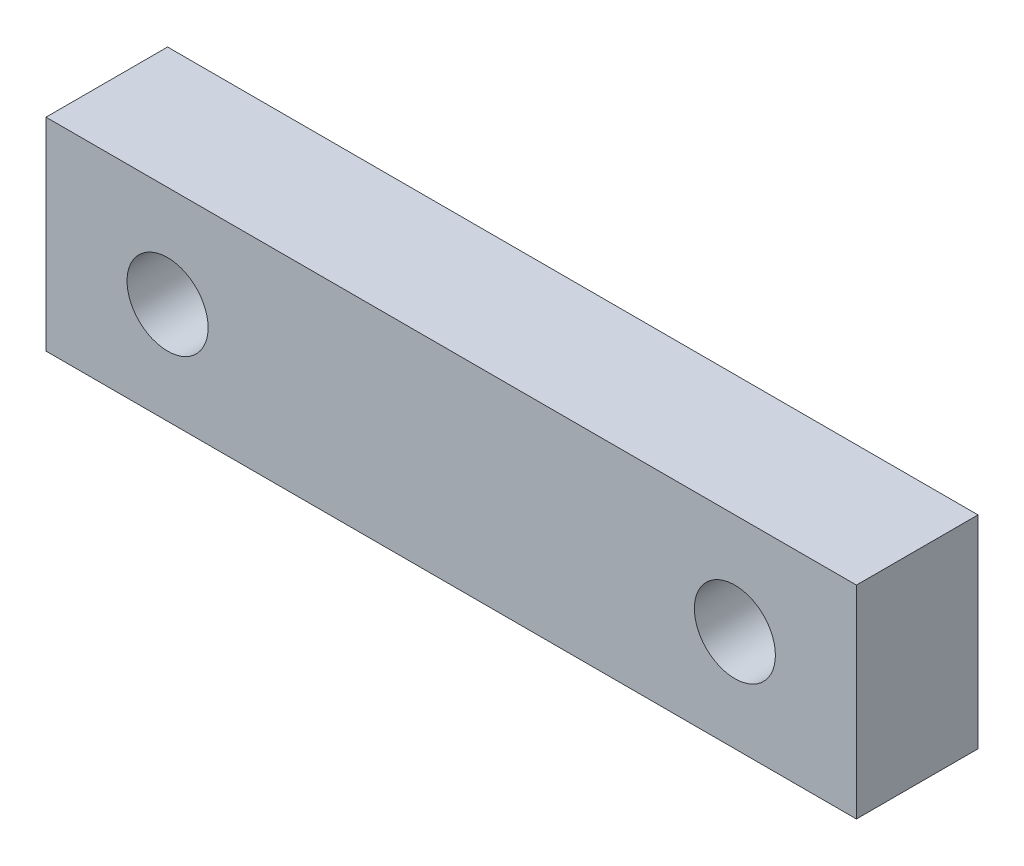
ISO-10303-21;
HEADER;
FILE_DESCRIPTION(('STEP AP214'),'2;1');
FILE_NAME('part.step','',(''),(''),'','','');
FILE_SCHEMA(('AUTOMOTIVE_DESIGN { 1 0 10303 214 1 1 1 1 }'));
ENDSEC;
DATA;
#1=APPLICATION_CONTEXT('core data for automotive mechanical design processes');
#2=APPLICATION_PROTOCOL_DEFINITION('international standard','automotive_design',2000,#1);
#3=PRODUCT_CONTEXT('',#1,'mechanical');
#4=PRODUCT('Part','Part','',(#3));
#5=PRODUCT_RELATED_PRODUCT_CATEGORY('part','',(#4));
#6=PRODUCT_DEFINITION_FORMATION('','',#4);
#7=PRODUCT_DEFINITION_CONTEXT('part definition',#1,'design');
#8=PRODUCT_DEFINITION('design','',#6,#7);
#9=PRODUCT_DEFINITION_SHAPE('','',#8);
#10=(LENGTH_UNIT() NAMED_UNIT(*) SI_UNIT(.MILLI.,.METRE.));
#11=(NAMED_UNIT(*) PLANE_ANGLE_UNIT() SI_UNIT($,.RADIAN.));
#12=(NAMED_UNIT(*) SI_UNIT($,.STERADIAN.) SOLID_ANGLE_UNIT());
#13=UNCERTAINTY_MEASURE_WITH_UNIT(LENGTH_MEASURE(1.E-05),#10,'distance_accuracy_value','');
#14=(GEOMETRIC_REPRESENTATION_CONTEXT(3) GLOBAL_UNCERTAINTY_ASSIGNED_CONTEXT((#13)) GLOBAL_UNIT_ASSIGNED_CONTEXT((#10,
#11,#12)) REPRESENTATION_CONTEXT('',''));
#15=CARTESIAN_POINT('',(0.,0.,0.));
#16=DIRECTION('',(0.,0.,1.));
#17=DIRECTION('',(1.,0.,0.));
#18=AXIS2_PLACEMENT_3D('',#15,#16,#17);
#19=CARTESIAN_POINT('',(0.,0.,3.));
#20=DIRECTION('',(0.,0.,-1.));
#21=DIRECTION('',(-1.,0.,0.));
#22=AXIS2_PLACEMENT_3D('',#19,#20,#21);
#23=PLANE('',#22);
#24=CARTESIAN_POINT('',(-91.6517492635778,16.5412698713838,3.));
#25=DIRECTION('',(0.,0.,1.));
#26=DIRECTION('',(1.,0.,0.));
#27=AXIS2_PLACEMENT_3D('',#24,#25,#26);
#28=CIRCLE('',#27,0.999999999999998);
#29=CARTESIAN_POINT('',(-90.6517492635778,16.5412698713838,3.));
#30=VERTEX_POINT('',#29);
#31=EDGE_CURVE('E100',#30,#30,#28,.T.);
#32=ORIENTED_EDGE('',*,*,#31,.F.);
#33=EDGE_LOOP('',(#32));
#34=FACE_BOUND('',#33,.T.);
#35=DIRECTION('',(0.,-1.,0.));
#36=VECTOR('',#35,1.);
#37=CARTESIAN_POINT('',(-94.6517492635778,14.0412698713838,3.));
#38=LINE('',#37,#36);
#39=CARTESIAN_POINT('',(-94.6517492635778,19.0412698713838,3.));
#40=VERTEX_POINT('',#39);
#41=CARTESIAN_POINT('',(-94.6517492635778,14.0412698713838,3.));
#42=VERTEX_POINT('',#41);
#43=EDGE_CURVE('E85',#40,#42,#38,.T.);
#44=ORIENTED_EDGE('',*,*,#43,.T.);
#45=DIRECTION('',(1.,0.,0.));
#46=VECTOR('',#45,1.);
#47=CARTESIAN_POINT('',(-74.6517492635778,14.0412698713838,3.));
#48=LINE('',#47,#46);
#49=CARTESIAN_POINT('',(-74.6517492635778,14.0412698713838,3.));
#50=VERTEX_POINT('',#49);
#51=EDGE_CURVE('E80',#42,#50,#48,.T.);
#52=ORIENTED_EDGE('',*,*,#51,.T.);
#53=DIRECTION('',(0.,1.,0.));
#54=VECTOR('',#53,1.);
#55=CARTESIAN_POINT('',(-74.6517492635778,19.0412698713838,3.));
#56=LINE('',#55,#54);
#57=CARTESIAN_POINT('',(-74.6517492635778,19.0412698713838,3.));
#58=VERTEX_POINT('',#57);
#59=EDGE_CURVE('E83',#50,#58,#56,.T.);
#60=ORIENTED_EDGE('',*,*,#59,.T.);
#61=DIRECTION('',(-1.,0.,0.));
#62=VECTOR('',#61,1.);
#63=CARTESIAN_POINT('',(-94.6517492635778,19.0412698713838,3.));
#64=LINE('',#63,#62);
#65=EDGE_CURVE('E50',#58,#40,#64,.T.);
#66=ORIENTED_EDGE('',*,*,#65,.T.);
#67=EDGE_LOOP('',(#44,#52,#60,#66));
#68=FACE_BOUND('',#67,.T.);
#69=CARTESIAN_POINT('',(-77.6517492635778,16.5412698713838,3.));
#70=DIRECTION('',(0.,0.,1.));
#71=DIRECTION('',(1.,0.,0.));
#72=AXIS2_PLACEMENT_3D('',#69,#70,#71);
#73=CIRCLE('',#72,0.999999999999998);
#74=CARTESIAN_POINT('',(-76.6517492635778,16.5412698713838,3.));
#75=VERTEX_POINT('',#74);
#76=EDGE_CURVE('E115',#75,#75,#73,.T.);
#77=ORIENTED_EDGE('',*,*,#76,.F.);
#78=EDGE_LOOP('',(#77));
#79=FACE_BOUND('',#78,.T.);
#80=ADVANCED_FACE('F33',(#34,#68,#79),#23,.F.);
#81=CARTESIAN_POINT('',(0.,0.,0.));
#82=DIRECTION('',(0.,0.,-1.));
#83=DIRECTION('',(-1.,0.,0.));
#84=AXIS2_PLACEMENT_3D('',#81,#82,#83);
#85=PLANE('',#84);
#86=CARTESIAN_POINT('',(-91.6517492635778,16.5412698713838,0.));
#87=DIRECTION('',(0.,0.,1.));
#88=DIRECTION('',(1.,0.,0.));
#89=AXIS2_PLACEMENT_3D('',#86,#87,#88);
#90=CIRCLE('',#89,0.999999999999998);
#91=CARTESIAN_POINT('',(-90.6517492635778,16.5412698713838,0.));
#92=VERTEX_POINT('',#91);
#93=EDGE_CURVE('E112',#92,#92,#90,.T.);
#94=ORIENTED_EDGE('',*,*,#93,.T.);
#95=EDGE_LOOP('',(#94));
#96=FACE_BOUND('',#95,.T.);
#97=DIRECTION('',(0.,-1.,0.));
#98=VECTOR('',#97,1.);
#99=CARTESIAN_POINT('',(-94.6517492635778,14.0412698713838,0.));
#100=LINE('',#99,#98);
#101=CARTESIAN_POINT('',(-94.6517492635778,19.0412698713838,0.));
#102=VERTEX_POINT('',#101);
#103=CARTESIAN_POINT('',(-94.6517492635778,14.0412698713838,0.));
#104=VERTEX_POINT('',#103);
#105=EDGE_CURVE('E97',#102,#104,#100,.T.);
#106=ORIENTED_EDGE('',*,*,#105,.F.);
#107=DIRECTION('',(-1.,0.,0.));
#108=VECTOR('',#107,1.);
#109=CARTESIAN_POINT('',(-94.6517492635778,19.0412698713838,0.));
#110=LINE('',#109,#108);
#111=CARTESIAN_POINT('',(-74.6517492635778,19.0412698713838,0.));
#112=VERTEX_POINT('',#111);
#113=EDGE_CURVE('E73',#112,#102,#110,.T.);
#114=ORIENTED_EDGE('',*,*,#113,.F.);
#115=DIRECTION('',(0.,1.,0.));
#116=VECTOR('',#115,1.);
#117=CARTESIAN_POINT('',(-74.6517492635778,19.0412698713838,0.));
#118=LINE('',#117,#116);
#119=CARTESIAN_POINT('',(-74.6517492635778,14.0412698713838,0.));
#120=VERTEX_POINT('',#119);
#121=EDGE_CURVE('E67',#120,#112,#118,.T.);
#122=ORIENTED_EDGE('',*,*,#121,.F.);
#123=DIRECTION('',(1.,0.,0.));
#124=VECTOR('',#123,1.);
#125=CARTESIAN_POINT('',(-74.6517492635778,14.0412698713838,0.));
#126=LINE('',#125,#124);
#127=EDGE_CURVE('E89',#104,#120,#126,.T.);
#128=ORIENTED_EDGE('',*,*,#127,.F.);
#129=EDGE_LOOP('',(#106,#114,#122,#128));
#130=FACE_BOUND('',#129,.T.);
#131=CARTESIAN_POINT('',(-77.6517492635778,16.5412698713838,0.));
#132=DIRECTION('',(0.,0.,1.));
#133=DIRECTION('',(1.,0.,0.));
#134=AXIS2_PLACEMENT_3D('',#131,#132,#133);
#135=CIRCLE('',#134,0.999999999999998);
#136=CARTESIAN_POINT('',(-76.6517492635778,16.5412698713838,0.));
#137=VERTEX_POINT('',#136);
#138=EDGE_CURVE('E118',#137,#137,#135,.T.);
#139=ORIENTED_EDGE('',*,*,#138,.T.);
#140=EDGE_LOOP('',(#139));
#141=FACE_BOUND('',#140,.T.);
#142=ADVANCED_FACE('F108',(#96,#130,#141),#85,.T.);
#143=CARTESIAN_POINT('',(-94.6517492635778,14.0412698713838,3.));
#144=DIRECTION('',(1.,0.,0.));
#145=DIRECTION('',(0.,0.,-1.));
#146=AXIS2_PLACEMENT_3D('',#143,#144,#145);
#147=PLANE('',#146);
#148=ORIENTED_EDGE('',*,*,#105,.T.);
#149=DIRECTION('',(0.,0.,-1.));
#150=VECTOR('',#149,1.);
#151=CARTESIAN_POINT('',(-94.6517492635778,14.0412698713838,3.));
#152=LINE('',#151,#150);
#153=EDGE_CURVE('E11',#42,#104,#152,.T.);
#154=ORIENTED_EDGE('',*,*,#153,.F.);
#155=ORIENTED_EDGE('',*,*,#43,.F.);
#156=DIRECTION('',(0.,0.,-1.));
#157=VECTOR('',#156,1.);
#158=CARTESIAN_POINT('',(-94.6517492635778,19.0412698713838,3.));
#159=LINE('',#158,#157);
#160=EDGE_CURVE('E93',#40,#102,#159,.T.);
#161=ORIENTED_EDGE('',*,*,#160,.T.);
#162=EDGE_LOOP('',(#148,#154,#155,#161));
#163=FACE_BOUND('',#162,.T.);
#164=ADVANCED_FACE('F35',(#163),#147,.F.);
#165=CARTESIAN_POINT('',(-74.6517492635778,14.0412698713838,3.));
#166=DIRECTION('',(0.,1.,0.));
#167=DIRECTION('',(0.,0.,1.));
#168=AXIS2_PLACEMENT_3D('',#165,#166,#167);
#169=PLANE('',#168);
#170=ORIENTED_EDGE('',*,*,#127,.T.);
#171=DIRECTION('',(0.,0.,-1.));
#172=VECTOR('',#171,1.);
#173=CARTESIAN_POINT('',(-74.6517492635778,14.0412698713838,3.));
#174=LINE('',#173,#172);
#175=EDGE_CURVE('E42',#50,#120,#174,.T.);
#176=ORIENTED_EDGE('',*,*,#175,.F.);
#177=ORIENTED_EDGE('',*,*,#51,.F.);
#178=ORIENTED_EDGE('',*,*,#153,.T.);
#179=EDGE_LOOP('',(#170,#176,#177,#178));
#180=FACE_BOUND('',#179,.T.);
#181=ADVANCED_FACE('F88',(#180),#169,.F.);
#182=CARTESIAN_POINT('',(-74.6517492635778,19.0412698713838,3.));
#183=DIRECTION('',(-1.,0.,0.));
#184=DIRECTION('',(0.,0.,1.));
#185=AXIS2_PLACEMENT_3D('',#182,#183,#184);
#186=PLANE('',#185);
#187=ORIENTED_EDGE('',*,*,#121,.T.);
#188=DIRECTION('',(0.,0.,-1.));
#189=VECTOR('',#188,1.);
#190=CARTESIAN_POINT('',(-74.6517492635778,19.0412698713838,3.));
#191=LINE('',#190,#189);
#192=EDGE_CURVE('E90',#58,#112,#191,.T.);
#193=ORIENTED_EDGE('',*,*,#192,.F.);
#194=ORIENTED_EDGE('',*,*,#59,.F.);
#195=ORIENTED_EDGE('',*,*,#175,.T.);
#196=EDGE_LOOP('',(#187,#193,#194,#195));
#197=FACE_BOUND('',#196,.T.);
#198=ADVANCED_FACE('F91',(#197),#186,.F.);
#199=CARTESIAN_POINT('',(-94.6517492635778,19.0412698713838,3.));
#200=DIRECTION('',(0.,-1.,0.));
#201=DIRECTION('',(0.,0.,-1.));
#202=AXIS2_PLACEMENT_3D('',#199,#200,#201);
#203=PLANE('',#202);
#204=ORIENTED_EDGE('',*,*,#113,.T.);
#205=ORIENTED_EDGE('',*,*,#160,.F.);
#206=ORIENTED_EDGE('',*,*,#65,.F.);
#207=ORIENTED_EDGE('',*,*,#192,.T.);
#208=EDGE_LOOP('',(#204,#205,#206,#207));
#209=FACE_BOUND('',#208,.T.);
#210=ADVANCED_FACE('F105',(#209),#203,.F.);
#211=CARTESIAN_POINT('',(-91.6517492635778,16.5412698713838,3.));
#212=DIRECTION('',(0.,0.,-1.));
#213=DIRECTION('',(-1.,0.,0.));
#214=AXIS2_PLACEMENT_3D('',#211,#212,#213);
#215=CYLINDRICAL_SURFACE('',#214,0.999999999999998);
#216=ORIENTED_EDGE('',*,*,#31,.T.);
#217=EDGE_LOOP('',(#216));
#218=FACE_BOUND('',#217,.T.);
#219=ORIENTED_EDGE('',*,*,#93,.F.);
#220=EDGE_LOOP('',(#219));
#221=FACE_BOUND('',#220,.T.);
#222=ADVANCED_FACE('F136',(#218,#221),#215,.F.);
#223=CARTESIAN_POINT('',(-77.6517492635778,16.5412698713838,3.));
#224=DIRECTION('',(0.,0.,-1.));
#225=DIRECTION('',(-1.,0.,0.));
#226=AXIS2_PLACEMENT_3D('',#223,#224,#225);
#227=CYLINDRICAL_SURFACE('',#226,0.999999999999998);
#228=ORIENTED_EDGE('',*,*,#76,.T.);
#229=EDGE_LOOP('',(#228));
#230=FACE_BOUND('',#229,.T.);
#231=ORIENTED_EDGE('',*,*,#138,.F.);
#232=EDGE_LOOP('',(#231));
#233=FACE_BOUND('',#232,.T.);
#234=ADVANCED_FACE('F124',(#230,#233),#227,.F.);
#235=CLOSED_SHELL('',(#80,#142,#164,#181,#198,#210,#222,#234));
#236=MANIFOLD_SOLID_BREP('B2',#235);
#237=ADVANCED_BREP_SHAPE_REPRESENTATION('',(#18,#236),#14);
#238=SHAPE_DEFINITION_REPRESENTATION(#9,#237);
ENDSEC;
END-ISO-10303-21;
